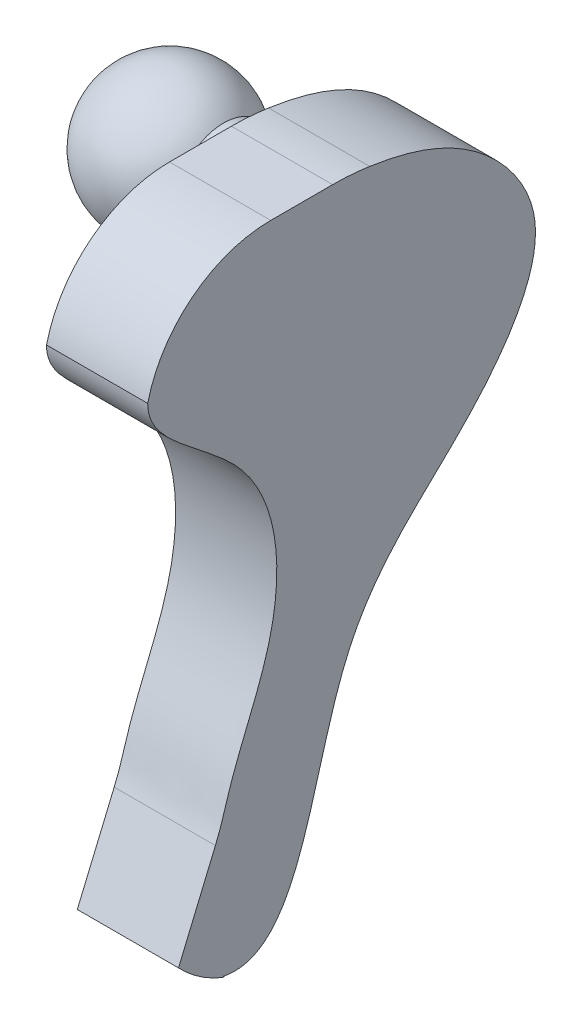
ISO-10303-21;
HEADER;
FILE_DESCRIPTION(('STEP AP214'),'2;1');
FILE_NAME('part.step','',(''),(''),'','','');
FILE_SCHEMA(('AUTOMOTIVE_DESIGN { 1 0 10303 214 1 1 1 1 }'));
ENDSEC;
DATA;
#1=APPLICATION_CONTEXT('core data for automotive mechanical design processes');
#2=APPLICATION_PROTOCOL_DEFINITION('international standard','automotive_design',2000,#1);
#3=PRODUCT_CONTEXT('',#1,'mechanical');
#4=PRODUCT('Part','Part','',(#3));
#5=PRODUCT_RELATED_PRODUCT_CATEGORY('part','',(#4));
#6=PRODUCT_DEFINITION_FORMATION('','',#4);
#7=PRODUCT_DEFINITION_CONTEXT('part definition',#1,'design');
#8=PRODUCT_DEFINITION('design','',#6,#7);
#9=PRODUCT_DEFINITION_SHAPE('','',#8);
#10=(LENGTH_UNIT() NAMED_UNIT(*) SI_UNIT(.MILLI.,.METRE.));
#11=(NAMED_UNIT(*) PLANE_ANGLE_UNIT() SI_UNIT($,.RADIAN.));
#12=(NAMED_UNIT(*) SI_UNIT($,.STERADIAN.) SOLID_ANGLE_UNIT());
#13=UNCERTAINTY_MEASURE_WITH_UNIT(LENGTH_MEASURE(1.E-05),#10,'distance_accuracy_value','');
#14=(GEOMETRIC_REPRESENTATION_CONTEXT(3) GLOBAL_UNCERTAINTY_ASSIGNED_CONTEXT((#13)) GLOBAL_UNIT_ASSIGNED_CONTEXT((#10,
#11,#12)) REPRESENTATION_CONTEXT('',''));
#15=CARTESIAN_POINT('',(0.,0.,0.));
#16=DIRECTION('',(0.,0.,1.));
#17=DIRECTION('',(1.,0.,0.));
#18=AXIS2_PLACEMENT_3D('',#15,#16,#17);
#19=CARTESIAN_POINT('',(0.,-10.,-8.89020005797834));
#20=DIRECTION('',(1.,0.,0.));
#21=DIRECTION('',(0.,0.,-1.));
#22=AXIS2_PLACEMENT_3D('',#19,#20,#21);
#23=CYLINDRICAL_SURFACE('',#22,10.);
#24=DIRECTION('',(1.,0.,0.));
#25=VECTOR('',#24,1.);
#26=CARTESIAN_POINT('',(4.,0.,-8.89020005797834));
#27=LINE('',#26,#25);
#28=CARTESIAN_POINT('',(4.,0.,-8.89020005797834));
#29=VERTEX_POINT('',#28);
#30=CARTESIAN_POINT('',(0.,0.,-8.89020005797834));
#31=VERTEX_POINT('',#30);
#32=EDGE_CURVE('E220',#29,#31,#27,.F.);
#33=ORIENTED_EDGE('',*,*,#32,.F.);
#34=CARTESIAN_POINT('',(4.,-10.,-8.89020005797834));
#35=DIRECTION('',(-1.,0.,0.));
#36=DIRECTION('',(0.,0.,1.));
#37=AXIS2_PLACEMENT_3D('',#34,#35,#36);
#38=CIRCLE('',#37,10.);
#39=CARTESIAN_POINT('',(4.,-0.108101078181222,-10.3566023631185));
#40=VERTEX_POINT('',#39);
#41=EDGE_CURVE('E222',#40,#29,#38,.F.);
#42=ORIENTED_EDGE('',*,*,#41,.F.);
#43=DIRECTION('',(1.,0.,0.));
#44=VECTOR('',#43,1.);
#45=CARTESIAN_POINT('',(0.,-0.108101078181222,-10.3566023631185));
#46=LINE('',#45,#44);
#47=CARTESIAN_POINT('',(0.,-0.108101078181222,-10.3566023631185));
#48=VERTEX_POINT('',#47);
#49=EDGE_CURVE('E224',#48,#40,#46,.T.);
#50=ORIENTED_EDGE('',*,*,#49,.F.);
#51=CARTESIAN_POINT('',(0.,-10.,-8.89020005797834));
#52=DIRECTION('',(-1.,0.,0.));
#53=DIRECTION('',(0.,0.,1.));
#54=AXIS2_PLACEMENT_3D('',#51,#52,#53);
#55=CIRCLE('',#54,10.);
#56=EDGE_CURVE('E40',#31,#48,#55,.T.);
#57=ORIENTED_EDGE('',*,*,#56,.F.);
#58=EDGE_LOOP('',(#33,#42,#50,#57));
#59=FACE_BOUND('',#58,.T.);
#60=ADVANCED_FACE('F32',(#59),#23,.T.);
#61=CARTESIAN_POINT('',(4.,0.,-6.44251884830741));
#62=DIRECTION('',(0.,-1.,0.));
#63=DIRECTION('',(0.,0.,-1.));
#64=AXIS2_PLACEMENT_3D('',#61,#62,#63);
#65=PLANE('',#64);
#66=DIRECTION('',(0.,0.,1.));
#67=VECTOR('',#66,1.);
#68=CARTESIAN_POINT('',(4.,0.,-6.44251884830741));
#69=LINE('',#68,#67);
#70=CARTESIAN_POINT('',(4.,0.,-6.44251884830741));
#71=VERTEX_POINT('',#70);
#72=EDGE_CURVE('E227',#29,#71,#69,.T.);
#73=ORIENTED_EDGE('',*,*,#72,.F.);
#74=ORIENTED_EDGE('',*,*,#32,.T.);
#75=DIRECTION('',(0.,0.,1.));
#76=VECTOR('',#75,1.);
#77=CARTESIAN_POINT('',(0.,0.,-6.44251884830741));
#78=LINE('',#77,#76);
#79=CARTESIAN_POINT('',(0.,0.,-6.44251884830741));
#80=VERTEX_POINT('',#79);
#81=EDGE_CURVE('E242',#31,#80,#78,.T.);
#82=ORIENTED_EDGE('',*,*,#81,.T.);
#83=DIRECTION('',(-1.,0.,0.));
#84=VECTOR('',#83,1.);
#85=CARTESIAN_POINT('',(4.,0.,-6.44251884830741));
#86=LINE('',#85,#84);
#87=EDGE_CURVE('E229',#71,#80,#86,.T.);
#88=ORIENTED_EDGE('',*,*,#87,.F.);
#89=EDGE_LOOP('',(#73,#74,#82,#88));
#90=FACE_BOUND('',#89,.T.);
#91=ADVANCED_FACE('F210',(#90),#65,.F.);
#92=CARTESIAN_POINT('',(4.,-5.,-6.44251884830737));
#93=DIRECTION('',(-1.,0.,0.));
#94=DIRECTION('',(0.,0.,1.));
#95=AXIS2_PLACEMENT_3D('',#92,#93,#94);
#96=CYLINDRICAL_SURFACE('',#95,5.);
#97=CARTESIAN_POINT('',(0.,-5.,-6.44251884830737));
#98=DIRECTION('',(1.,0.,0.));
#99=DIRECTION('',(0.,0.,1.));
#100=AXIS2_PLACEMENT_3D('',#97,#98,#99);
#101=CIRCLE('',#100,5.);
#102=CARTESIAN_POINT('',(0.,-3.83361375291554,-1.58046751963835));
#103=VERTEX_POINT('',#102);
#104=EDGE_CURVE('E236',#80,#103,#101,.T.);
#105=ORIENTED_EDGE('',*,*,#104,.T.);
#106=DIRECTION('',(1.,0.,0.));
#107=VECTOR('',#106,1.);
#108=CARTESIAN_POINT('',(-6.,-3.83361375291554,-1.58046751963835));
#109=LINE('',#108,#107);
#110=CARTESIAN_POINT('',(4.,-3.83361375291554,-1.58046751963835));
#111=VERTEX_POINT('',#110);
#112=EDGE_CURVE('E107',#103,#111,#109,.T.);
#113=ORIENTED_EDGE('',*,*,#112,.T.);
#114=CARTESIAN_POINT('',(4.,-5.,-6.44251884830737));
#115=DIRECTION('',(1.,0.,0.));
#116=DIRECTION('',(0.,0.,1.));
#117=AXIS2_PLACEMENT_3D('',#114,#115,#116);
#118=CIRCLE('',#117,5.);
#119=EDGE_CURVE('E232',#71,#111,#118,.T.);
#120=ORIENTED_EDGE('',*,*,#119,.F.);
#121=ORIENTED_EDGE('',*,*,#87,.T.);
#122=EDGE_LOOP('',(#105,#113,#120,#121));
#123=FACE_BOUND('',#122,.T.);
#124=ADVANCED_FACE('F206',(#123),#96,.T.);
#125=CARTESIAN_POINT('',(4.,-20.3454021103039,-6.44251884830737));
#126=DIRECTION('',(-1.,0.,0.));
#127=DIRECTION('',(0.,0.,1.));
#128=AXIS2_PLACEMENT_3D('',#125,#126,#127);
#129=CYLINDRICAL_SURFACE('',#128,5.);
#130=CARTESIAN_POINT('',(4.,-20.3454021103039,-6.44251884830737));
#131=DIRECTION('',(1.,0.,0.));
#132=DIRECTION('',(0.,0.,1.));
#133=AXIS2_PLACEMENT_3D('',#130,#131,#132);
#134=CIRCLE('',#133,5.);
#135=CARTESIAN_POINT('',(4.,-23.7676290327875,-2.79719816405634));
#136=VERTEX_POINT('',#135);
#137=CARTESIAN_POINT('',(4.,-24.9673450466533,-4.53525811806357));
#138=VERTEX_POINT('',#137);
#139=EDGE_CURVE('E234',#136,#138,#134,.T.);
#140=ORIENTED_EDGE('',*,*,#139,.F.);
#141=DIRECTION('',(-1.,0.,0.));
#142=VECTOR('',#141,1.);
#143=CARTESIAN_POINT('',(4.,-23.7676290327875,-2.79719816405635));
#144=LINE('',#143,#142);
#145=CARTESIAN_POINT('',(0.,-23.7676290327875,-2.79719816405635));
#146=VERTEX_POINT('',#145);
#147=EDGE_CURVE('E122',#136,#146,#144,.T.);
#148=ORIENTED_EDGE('',*,*,#147,.T.);
#149=CARTESIAN_POINT('',(0.,-20.3454021103039,-6.44251884830737));
#150=DIRECTION('',(1.,0.,0.));
#151=DIRECTION('',(0.,0.,1.));
#152=AXIS2_PLACEMENT_3D('',#149,#150,#151);
#153=CIRCLE('',#152,5.);
#154=CARTESIAN_POINT('',(0.,-24.9673450466533,-4.53525811806357));
#155=VERTEX_POINT('',#154);
#156=EDGE_CURVE('E120',#146,#155,#153,.T.);
#157=ORIENTED_EDGE('',*,*,#156,.T.);
#158=DIRECTION('',(1.,0.,0.));
#159=VECTOR('',#158,1.);
#160=CARTESIAN_POINT('',(-6.,-24.9673450466533,-4.53525811806358));
#161=LINE('',#160,#159);
#162=EDGE_CURVE('E174',#155,#138,#161,.T.);
#163=ORIENTED_EDGE('',*,*,#162,.T.);
#164=EDGE_LOOP('',(#140,#148,#157,#163));
#165=FACE_BOUND('',#164,.T.);
#166=ADVANCED_FACE('F200',(#165),#129,.T.);
#167=CARTESIAN_POINT('',(4.,-20.3454021103039,-13.4096193294607));
#168=DIRECTION('',(-1.,0.,0.));
#169=DIRECTION('',(0.,0.,1.));
#170=AXIS2_PLACEMENT_3D('',#167,#168,#169);
#171=PLANE('',#170);
#172=CARTESIAN_POINT('',(4.,0.,-9.46398265999981));
#173=CARTESIAN_POINT('',(4.,-0.168664697487083,-11.2075030009191));
#174=CARTESIAN_POINT('',(4.,-0.885845558257227,-14.4094371098565));
#175=CARTESIAN_POINT('',(4.,-5.60097300823879,-18.0930709122053));
#176=CARTESIAN_POINT('',(4.,-11.506879239675,-14.0349278188816));
#177=CARTESIAN_POINT('',(4.,-15.2393930061489,-8.19106930747239));
#178=CARTESIAN_POINT('',(4.,-27.2833064156389,-7.57529253879667));
#179=CARTESIAN_POINT('',(4.,-23.3044879221963,-1.44327655506523));
#180=CARTESIAN_POINT('',(4.,-21.1480104848914,-4.18145183436443));
#181=CARTESIAN_POINT('',(4.,-17.9621122269507,-4.87451716439374));
#182=CARTESIAN_POINT('',(4.,-13.8026627271112,-7.11898897478478));
#183=CARTESIAN_POINT('',(4.,-7.53032965837444,-6.5440494480064));
#184=CARTESIAN_POINT('',(4.,-4.84801633932555,-0.424200341636191));
#185=CARTESIAN_POINT('',(4.,-0.8121095912682,-3.03315303175542));
#186=CARTESIAN_POINT('',(4.,0.150810087515933,-6.16364399963838));
#187=CARTESIAN_POINT('',(4.,0.0976871789813631,-8.45417096769786));
#188=CARTESIAN_POINT('',(4.,0.,-9.46398265999981));
#189=B_SPLINE_CURVE_WITH_KNOTS('',3,(#172,#173,#174,#175,#176,#177,#178,#179,#180,#181,#182,
#183,#184,#185,#186,#187,#188),.UNSPECIFIED.,.T.,.F.,(4,1,1,1,1,1,1,1,1,1,1,1,1,1,4),(0.,
0.0779462206245738,0.143334378897667,0.228662797986688,0.34549718402757,0.49327154543466,
0.530449611955508,0.570400737368921,0.608236932320176,0.680812242057208,0.778589658100487,
0.85710748647938,0.897676897296645,0.954855126659468,1.),.UNSPECIFIED.);
#190=CARTESIAN_POINT('',(4.,-20.3068283020613,-4.2559361978416));
#191=VERTEX_POINT('',#190);
#192=EDGE_CURVE('E387',#191,#111,#189,.T.);
#193=ORIENTED_EDGE('',*,*,#192,.F.);
#194=DIRECTION('',(0.,-0.921486867455821,0.388409517270701));
#195=VECTOR('',#194,1.);
#196=CARTESIAN_POINT('',(4.,-17.063348980249,-5.62307259680175));
#197=LINE('',#196,#195);
#198=EDGE_CURVE('E47',#191,#136,#197,.T.);
#199=ORIENTED_EDGE('',*,*,#198,.T.);
#200=ORIENTED_EDGE('',*,*,#139,.T.);
#201=CARTESIAN_POINT('',(4.,-24.6463789862283,-6.87662953852897));
#202=CARTESIAN_POINT('',(4.,-24.6976036054736,-6.34865285678219));
#203=CARTESIAN_POINT('',(4.,-25.1810411070529,-5.70517041603861));
#204=CARTESIAN_POINT('',(4.,-24.6439737268939,-2.96717959946021));
#205=CARTESIAN_POINT('',(4.,-26.5247151757715,-6.79867928296908));
#206=CARTESIAN_POINT('',(4.,-25.4377812076341,-10.1982205077126));
#207=CARTESIAN_POINT('',(4.,-24.5623433988899,-7.74279177077801));
#208=CARTESIAN_POINT('',(4.,-24.6463789862283,-6.87662953852897));
#209=B_SPLINE_CURVE_WITH_KNOTS('',3,(#201,#202,#203,#204,#205,#206,#207,#208),.UNSPECIFIED.,.T.,
.F.,(4,1,1,1,1,4),(0.,0.142115472516294,0.262842986327426,0.57618363660915,0.766855129842875,
1.),.UNSPECIFIED.);
#210=CARTESIAN_POINT('',(4.,-24.9754382899134,-4.62207240952031));
#211=VERTEX_POINT('',#210);
#212=EDGE_CURVE('E139',#211,#138,#209,.T.);
#213=ORIENTED_EDGE('',*,*,#212,.F.);
#214=CARTESIAN_POINT('',(4.,-24.8659980937708,-4.40682622304461));
#215=CARTESIAN_POINT('',(4.,-25.5656102420994,-5.64326897110136));
#216=CARTESIAN_POINT('',(4.,-24.3965311519043,-9.32752984598735));
#217=CARTESIAN_POINT('',(4.,-37.6373865505527,-20.9490535253005));
#218=CARTESIAN_POINT('',(4.,7.04668932132763,-40.1080361356464));
#219=CARTESIAN_POINT('',(4.,5.04572595414695,-11.067178353838));
#220=CARTESIAN_POINT('',(4.,4.10433483589114,13.2242876999897));
#221=CARTESIAN_POINT('',(4.,-20.1620323431838,4.69415788094612));
#222=CARTESIAN_POINT('',(4.,-23.304173715489,-2.46978145232845));
#223=B_SPLINE_CURVE_WITH_KNOTS('',3,(#214,#215,#216,#217,#218,#219,#220,#221,#222),
.UNSPECIFIED.,.F.,.F.,(4,1,1,1,1,1,4),(0.,0.0384597484958003,0.0972966500268078,
0.409886449456031,0.593670055107859,0.744469586063736,1.),.UNSPECIFIED.);
#224=CARTESIAN_POINT('',(4.,-24.9378851477119,-4.54273995287266));
#225=VERTEX_POINT('',#224);
#226=EDGE_CURVE('E381',#225,#211,#223,.T.);
#227=ORIENTED_EDGE('',*,*,#226,.F.);
#228=CARTESIAN_POINT('',(4.,0.,-9.46398265999981));
#229=CARTESIAN_POINT('',(4.,-0.168664697487083,-11.2075030009191));
#230=CARTESIAN_POINT('',(4.,-0.885845558257227,-14.4094371098565));
#231=CARTESIAN_POINT('',(4.,-5.60097300823879,-18.0930709122053));
#232=CARTESIAN_POINT('',(4.,-11.506879239675,-14.0349278188816));
#233=CARTESIAN_POINT('',(4.,-15.2393930061489,-8.19106930747239));
#234=CARTESIAN_POINT('',(4.,-27.2833064156389,-7.57529253879667));
#235=CARTESIAN_POINT('',(4.,-23.3044879221963,-1.44327655506523));
#236=CARTESIAN_POINT('',(4.,-21.1480104848914,-4.18145183436443));
#237=CARTESIAN_POINT('',(4.,-17.9621122269507,-4.87451716439374));
#238=CARTESIAN_POINT('',(4.,-13.8026627271112,-7.11898897478478));
#239=CARTESIAN_POINT('',(4.,-7.53032965837444,-6.5440494480064));
#240=CARTESIAN_POINT('',(4.,-4.84801633932555,-0.424200341636191));
#241=CARTESIAN_POINT('',(4.,-0.8121095912682,-3.03315303175542));
#242=CARTESIAN_POINT('',(4.,0.150810087515933,-6.16364399963838));
#243=CARTESIAN_POINT('',(4.,0.0976871789813631,-8.45417096769786));
#244=CARTESIAN_POINT('',(4.,0.,-9.46398265999981));
#245=B_SPLINE_CURVE_WITH_KNOTS('',3,(#228,#229,#230,#231,#232,#233,#234,#235,#236,#237,#238,
#239,#240,#241,#242,#243,#244),.UNSPECIFIED.,.T.,.F.,(4,1,1,1,1,1,1,1,1,1,1,1,1,1,4),(0.,
0.0779462206245738,0.143334378897667,0.228662797986688,0.34549718402757,0.49327154543466,
0.530449611955508,0.570400737368921,0.608236932320176,0.680812242057208,0.778589658100487,
0.85710748647938,0.897676897296645,0.954855126659468,1.),.UNSPECIFIED.);
#246=EDGE_CURVE('E180',#40,#225,#245,.T.);
#247=ORIENTED_EDGE('',*,*,#246,.F.);
#248=ORIENTED_EDGE('',*,*,#41,.T.);
#249=ORIENTED_EDGE('',*,*,#72,.T.);
#250=ORIENTED_EDGE('',*,*,#119,.T.);
#251=EDGE_LOOP('',(#193,#199,#200,#213,#227,#247,#248,#249,#250));
#252=FACE_BOUND('',#251,.T.);
#253=ADVANCED_FACE('F197',(#252),#171,.F.);
#254=CARTESIAN_POINT('',(0.,-20.3454021103039,-13.4096193294607));
#255=DIRECTION('',(-1.,0.,0.));
#256=DIRECTION('',(0.,0.,1.));
#257=AXIS2_PLACEMENT_3D('',#254,#255,#256);
#258=PLANE('',#257);
#259=CARTESIAN_POINT('',(0.,-20.1409876750939,-4.32583852650107));
#260=CARTESIAN_POINT('',(0.,-24.5054493005803,-2.48620467715277));
#261=B_SPLINE_CURVE_WITH_KNOTS('',1,(#259,#260),.UNSPECIFIED.,.F.,.F.,(2,2),(0.,1.),.UNSPECIFIED.);
#262=CARTESIAN_POINT('',(0.,-20.3068282752446,-4.25593620914493));
#263=VERTEX_POINT('',#262);
#264=EDGE_CURVE('E114',#263,#146,#261,.T.);
#265=ORIENTED_EDGE('',*,*,#264,.F.);
#266=CARTESIAN_POINT('',(0.,0.,-9.46398265999981));
#267=CARTESIAN_POINT('',(0.,-0.168664697487083,-11.2075030009191));
#268=CARTESIAN_POINT('',(0.,-0.885845558257227,-14.4094371098565));
#269=CARTESIAN_POINT('',(0.,-5.60097300823879,-18.0930709122053));
#270=CARTESIAN_POINT('',(0.,-11.506879239675,-14.0349278188816));
#271=CARTESIAN_POINT('',(0.,-15.2393930061489,-8.19106930747239));
#272=CARTESIAN_POINT('',(0.,-27.2833064156389,-7.57529253879667));
#273=CARTESIAN_POINT('',(0.,-23.3044879221963,-1.44327655506523));
#274=CARTESIAN_POINT('',(0.,-21.1480104848914,-4.18145183436443));
#275=CARTESIAN_POINT('',(0.,-17.9621122269507,-4.87451716439374));
#276=CARTESIAN_POINT('',(0.,-13.8026627271112,-7.11898897478478));
#277=CARTESIAN_POINT('',(0.,-7.53032965837444,-6.5440494480064));
#278=CARTESIAN_POINT('',(0.,-4.84801633932555,-0.424200341636191));
#279=CARTESIAN_POINT('',(0.,-0.8121095912682,-3.03315303175542));
#280=CARTESIAN_POINT('',(0.,0.150810087515933,-6.16364399963838));
#281=CARTESIAN_POINT('',(0.,0.0976871789813631,-8.45417096769786));
#282=CARTESIAN_POINT('',(0.,0.,-9.46398265999981));
#283=B_SPLINE_CURVE_WITH_KNOTS('',3,(#266,#267,#268,#269,#270,#271,#272,#273,#274,#275,#276,
#277,#278,#279,#280,#281,#282),.UNSPECIFIED.,.T.,.F.,(4,1,1,1,1,1,1,1,1,1,1,1,1,1,4),(0.,
0.0779462206245738,0.143334378897667,0.228662797986688,0.34549718402757,0.49327154543466,
0.530449611955508,0.570400737368921,0.608236932320176,0.680812242057208,0.778589658100487,
0.85710748647938,0.897676897296645,0.954855126659468,1.),.UNSPECIFIED.);
#284=EDGE_CURVE('E103',#103,#263,#283,.F.);
#285=ORIENTED_EDGE('',*,*,#284,.F.);
#286=ORIENTED_EDGE('',*,*,#104,.F.);
#287=ORIENTED_EDGE('',*,*,#81,.F.);
#288=ORIENTED_EDGE('',*,*,#56,.T.);
#289=CARTESIAN_POINT('',(0.,0.,-9.46398265999981));
#290=CARTESIAN_POINT('',(0.,-0.168664697487083,-11.2075030009191));
#291=CARTESIAN_POINT('',(0.,-0.885845558257227,-14.4094371098565));
#292=CARTESIAN_POINT('',(0.,-5.60097300823879,-18.0930709122053));
#293=CARTESIAN_POINT('',(0.,-11.506879239675,-14.0349278188816));
#294=CARTESIAN_POINT('',(0.,-15.2393930061489,-8.19106930747239));
#295=CARTESIAN_POINT('',(0.,-27.2833064156389,-7.57529253879667));
#296=CARTESIAN_POINT('',(0.,-23.3044879221963,-1.44327655506523));
#297=CARTESIAN_POINT('',(0.,-21.1480104848914,-4.18145183436443));
#298=CARTESIAN_POINT('',(0.,-17.9621122269507,-4.87451716439374));
#299=CARTESIAN_POINT('',(0.,-13.8026627271112,-7.11898897478478));
#300=CARTESIAN_POINT('',(0.,-7.53032965837444,-6.5440494480064));
#301=CARTESIAN_POINT('',(0.,-4.84801633932555,-0.424200341636191));
#302=CARTESIAN_POINT('',(0.,-0.8121095912682,-3.03315303175542));
#303=CARTESIAN_POINT('',(0.,0.150810087515933,-6.16364399963838));
#304=CARTESIAN_POINT('',(0.,0.0976871789813631,-8.45417096769786));
#305=CARTESIAN_POINT('',(0.,0.,-9.46398265999981));
#306=B_SPLINE_CURVE_WITH_KNOTS('',3,(#289,#290,#291,#292,#293,#294,#295,#296,#297,#298,#299,
#300,#301,#302,#303,#304,#305),.UNSPECIFIED.,.T.,.F.,(4,1,1,1,1,1,1,1,1,1,1,1,1,1,4),(0.,
0.0779462206245738,0.143334378897667,0.228662797986688,0.34549718402757,0.49327154543466,
0.530449611955508,0.570400737368921,0.608236932320176,0.680812242057208,0.778589658100487,
0.85710748647938,0.897676897296645,0.954855126659468,1.),.UNSPECIFIED.);
#307=CARTESIAN_POINT('',(0.,-24.9378851477119,-4.54273995287266));
#308=VERTEX_POINT('',#307);
#309=EDGE_CURVE('E111',#308,#48,#306,.F.);
#310=ORIENTED_EDGE('',*,*,#309,.F.);
#311=CARTESIAN_POINT('',(0.,-24.8659980937708,-4.40682622304461));
#312=CARTESIAN_POINT('',(0.,-25.5656102420994,-5.64326897110136));
#313=CARTESIAN_POINT('',(0.,-24.3965311519043,-9.32752984598735));
#314=CARTESIAN_POINT('',(0.,-37.6373865505527,-20.9490535253005));
#315=CARTESIAN_POINT('',(0.,7.04668932132763,-40.1080361356464));
#316=CARTESIAN_POINT('',(0.,5.04572595414695,-11.067178353838));
#317=CARTESIAN_POINT('',(0.,4.10433483589114,13.2242876999897));
#318=CARTESIAN_POINT('',(0.,-20.1620323431838,4.69415788094612));
#319=CARTESIAN_POINT('',(0.,-23.304173715489,-2.46978145232845));
#320=B_SPLINE_CURVE_WITH_KNOTS('',3,(#311,#312,#313,#314,#315,#316,#317,#318,#319),
.UNSPECIFIED.,.F.,.F.,(4,1,1,1,1,1,4),(0.,0.0384597484958003,0.0972966500268078,
0.409886449456031,0.593670055107859,0.744469586063736,1.),.UNSPECIFIED.);
#321=CARTESIAN_POINT('',(0.,-24.9754382879083,-4.62207238846982));
#322=VERTEX_POINT('',#321);
#323=EDGE_CURVE('E246',#322,#308,#320,.F.);
#324=ORIENTED_EDGE('',*,*,#323,.F.);
#325=CARTESIAN_POINT('',(0.,-24.6463789862283,-6.87662953852897));
#326=CARTESIAN_POINT('',(0.,-24.6976036054736,-6.34865285678219));
#327=CARTESIAN_POINT('',(0.,-25.1810411070529,-5.70517041603861));
#328=CARTESIAN_POINT('',(0.,-24.6439737268939,-2.96717959946021));
#329=CARTESIAN_POINT('',(0.,-26.5247151757715,-6.79867928296908));
#330=CARTESIAN_POINT('',(0.,-25.4377812076341,-10.1982205077126));
#331=CARTESIAN_POINT('',(0.,-24.5623433988899,-7.74279177077801));
#332=CARTESIAN_POINT('',(0.,-24.6463789862283,-6.87662953852897));
#333=B_SPLINE_CURVE_WITH_KNOTS('',3,(#325,#326,#327,#328,#329,#330,#331,#332),.UNSPECIFIED.,.T.,
.F.,(4,1,1,1,1,4),(0.,0.142115472516294,0.262842986327426,0.57618363660915,0.766855129842875,
1.),.UNSPECIFIED.);
#334=EDGE_CURVE('E167',#155,#322,#333,.F.);
#335=ORIENTED_EDGE('',*,*,#334,.F.);
#336=ORIENTED_EDGE('',*,*,#156,.F.);
#337=EDGE_LOOP('',(#265,#285,#286,#287,#288,#310,#324,#335,#336));
#338=FACE_BOUND('',#337,.T.);
#339=CARTESIAN_POINT('',(0.,-5.17694696722693,-12.0792389764325));
#340=DIRECTION('',(-1.,0.,0.));
#341=DIRECTION('',(0.,0.917226045230669,0.398367144667463));
#342=AXIS2_PLACEMENT_3D('',#339,#340,#341);
#343=ELLIPSE('',#342,1.83432270993306,1.64818157560468);
#344=CARTESIAN_POINT('',(0.,-3.49445840231822,-11.3485050760778));
#345=VERTEX_POINT('',#344);
#346=EDGE_CURVE('E140',#345,#345,#343,.T.);
#347=ORIENTED_EDGE('',*,*,#346,.F.);
#348=EDGE_LOOP('',(#347));
#349=FACE_BOUND('',#348,.T.);
#350=ADVANCED_FACE('F117',(#338,#349),#258,.T.);
#351=CARTESIAN_POINT('',(-6.,-24.8659980937708,-4.40682622304461));
#352=CARTESIAN_POINT('',(-6.,-25.5656102420994,-5.64326897110136));
#353=CARTESIAN_POINT('',(-6.,-24.3965311519043,-9.32752984598735));
#354=CARTESIAN_POINT('',(-6.,-37.6373865505527,-20.9490535253005));
#355=CARTESIAN_POINT('',(-6.,7.04668932132763,-40.1080361356464));
#356=CARTESIAN_POINT('',(-6.,5.04572595414695,-11.067178353838));
#357=CARTESIAN_POINT('',(-6.,4.10433483589114,13.2242876999897));
#358=CARTESIAN_POINT('',(-6.,-20.1620323431838,4.69415788094612));
#359=CARTESIAN_POINT('',(-6.,-23.304173715489,-2.46978145232845));
#360=B_SPLINE_CURVE_WITH_KNOTS('',3,(#351,#352,#353,#354,#355,#356,#357,#358,#359),
.UNSPECIFIED.,.F.,.F.,(4,1,1,1,1,1,4),(0.,0.0384597484958003,0.0972966500268078,
0.409886449456031,0.593670055107859,0.744469586063736,1.),.UNSPECIFIED.);
#361=DIRECTION('',(1.,0.,0.));
#362=VECTOR('',#361,1.);
#363=SURFACE_OF_LINEAR_EXTRUSION('',#360,#362);
#364=ORIENTED_EDGE('',*,*,#226,.T.);
#365=DIRECTION('',(1.,0.,0.));
#366=VECTOR('',#365,1.);
#367=CARTESIAN_POINT('',(-6.,-24.9754382879083,-4.62207238846981));
#368=LINE('',#367,#366);
#369=EDGE_CURVE('E110',#211,#322,#368,.F.);
#370=ORIENTED_EDGE('',*,*,#369,.T.);
#371=ORIENTED_EDGE('',*,*,#323,.T.);
#372=DIRECTION('',(1.,0.,0.));
#373=VECTOR('',#372,1.);
#374=CARTESIAN_POINT('',(-6.,-24.9378851477119,-4.54273995287266));
#375=LINE('',#374,#373);
#376=EDGE_CURVE('E384',#308,#225,#375,.T.);
#377=ORIENTED_EDGE('',*,*,#376,.T.);
#378=EDGE_LOOP('',(#364,#370,#371,#377));
#379=FACE_BOUND('',#378,.T.);
#380=ADVANCED_FACE('F195',(#379),#363,.F.);
#381=CARTESIAN_POINT('',(-6.,0.,-9.46398265999981));
#382=CARTESIAN_POINT('',(-6.,-0.168664697487083,-11.2075030009191));
#383=CARTESIAN_POINT('',(-6.,-0.885845558257227,-14.4094371098565));
#384=CARTESIAN_POINT('',(-6.,-5.60097300823879,-18.0930709122053));
#385=CARTESIAN_POINT('',(-6.,-11.506879239675,-14.0349278188816));
#386=CARTESIAN_POINT('',(-6.,-15.2393930061489,-8.19106930747239));
#387=CARTESIAN_POINT('',(-6.,-27.2833064156389,-7.57529253879667));
#388=CARTESIAN_POINT('',(-6.,-23.3044879221963,-1.44327655506523));
#389=CARTESIAN_POINT('',(-6.,-21.1480104848914,-4.18145183436443));
#390=CARTESIAN_POINT('',(-6.,-17.9621122269507,-4.87451716439374));
#391=CARTESIAN_POINT('',(-6.,-13.8026627271112,-7.11898897478478));
#392=CARTESIAN_POINT('',(-6.,-7.53032965837444,-6.5440494480064));
#393=CARTESIAN_POINT('',(-6.,-4.84801633932555,-0.424200341636191));
#394=CARTESIAN_POINT('',(-6.,-0.8121095912682,-3.03315303175542));
#395=CARTESIAN_POINT('',(-6.,0.150810087515933,-6.16364399963838));
#396=CARTESIAN_POINT('',(-6.,0.0976871789813631,-8.45417096769786));
#397=CARTESIAN_POINT('',(-6.,0.,-9.46398265999981));
#398=B_SPLINE_CURVE_WITH_KNOTS('',3,(#381,#382,#383,#384,#385,#386,#387,#388,#389,#390,#391,
#392,#393,#394,#395,#396,#397),.UNSPECIFIED.,.T.,.F.,(4,1,1,1,1,1,1,1,1,1,1,1,1,1,4),(0.,
0.0779462206245738,0.143334378897667,0.228662797986688,0.34549718402757,0.49327154543466,
0.530449611955508,0.570400737368921,0.608236932320176,0.680812242057208,0.778589658100487,
0.85710748647938,0.897676897296645,0.954855126659468,1.),.UNSPECIFIED.);
#399=DIRECTION('',(1.,0.,0.));
#400=VECTOR('',#399,1.);
#401=SURFACE_OF_LINEAR_EXTRUSION('',#398,#400);
#402=ORIENTED_EDGE('',*,*,#309,.T.);
#403=ORIENTED_EDGE('',*,*,#49,.T.);
#404=ORIENTED_EDGE('',*,*,#246,.T.);
#405=ORIENTED_EDGE('',*,*,#376,.F.);
#406=EDGE_LOOP('',(#402,#403,#404,#405));
#407=FACE_BOUND('',#406,.T.);
#408=ADVANCED_FACE('F192',(#407),#401,.F.);
#409=CARTESIAN_POINT('',(-6.,0.,-9.46398265999981));
#410=CARTESIAN_POINT('',(-6.,-0.168664697487083,-11.2075030009191));
#411=CARTESIAN_POINT('',(-6.,-0.885845558257227,-14.4094371098565));
#412=CARTESIAN_POINT('',(-6.,-5.60097300823879,-18.0930709122053));
#413=CARTESIAN_POINT('',(-6.,-11.506879239675,-14.0349278188816));
#414=CARTESIAN_POINT('',(-6.,-15.2393930061489,-8.19106930747239));
#415=CARTESIAN_POINT('',(-6.,-27.2833064156389,-7.57529253879667));
#416=CARTESIAN_POINT('',(-6.,-23.3044879221963,-1.44327655506523));
#417=CARTESIAN_POINT('',(-6.,-21.1480104848914,-4.18145183436443));
#418=CARTESIAN_POINT('',(-6.,-17.9621122269507,-4.87451716439374));
#419=CARTESIAN_POINT('',(-6.,-13.8026627271112,-7.11898897478478));
#420=CARTESIAN_POINT('',(-6.,-7.53032965837444,-6.5440494480064));
#421=CARTESIAN_POINT('',(-6.,-4.84801633932555,-0.424200341636191));
#422=CARTESIAN_POINT('',(-6.,-0.8121095912682,-3.03315303175542));
#423=CARTESIAN_POINT('',(-6.,0.150810087515933,-6.16364399963838));
#424=CARTESIAN_POINT('',(-6.,0.0976871789813631,-8.45417096769786));
#425=CARTESIAN_POINT('',(-6.,0.,-9.46398265999981));
#426=B_SPLINE_CURVE_WITH_KNOTS('',3,(#409,#410,#411,#412,#413,#414,#415,#416,#417,#418,#419,
#420,#421,#422,#423,#424,#425),.UNSPECIFIED.,.T.,.F.,(4,1,1,1,1,1,1,1,1,1,1,1,1,1,4),(0.,
0.0779462206245738,0.143334378897667,0.228662797986688,0.34549718402757,0.49327154543466,
0.530449611955508,0.570400737368921,0.608236932320176,0.680812242057208,0.778589658100487,
0.85710748647938,0.897676897296645,0.954855126659468,1.),.UNSPECIFIED.);
#427=DIRECTION('',(1.,0.,0.));
#428=VECTOR('',#427,1.);
#429=SURFACE_OF_LINEAR_EXTRUSION('',#426,#428);
#430=ORIENTED_EDGE('',*,*,#284,.T.);
#431=DIRECTION('',(1.,0.,0.));
#432=VECTOR('',#431,1.);
#433=CARTESIAN_POINT('',(2.,-20.3068283020613,-4.2559361978416));
#434=LINE('',#433,#432);
#435=EDGE_CURVE('E11',#263,#191,#434,.T.);
#436=ORIENTED_EDGE('',*,*,#435,.T.);
#437=ORIENTED_EDGE('',*,*,#192,.T.);
#438=ORIENTED_EDGE('',*,*,#112,.F.);
#439=EDGE_LOOP('',(#430,#436,#437,#438));
#440=FACE_BOUND('',#439,.T.);
#441=ADVANCED_FACE('F104',(#440),#429,.F.);
#442=CARTESIAN_POINT('',(-6.,-24.6463789862283,-6.87662953852897));
#443=CARTESIAN_POINT('',(-6.,-24.6976036054736,-6.34865285678219));
#444=CARTESIAN_POINT('',(-6.,-25.1810411070529,-5.70517041603861));
#445=CARTESIAN_POINT('',(-6.,-24.6439737268939,-2.96717959946021));
#446=CARTESIAN_POINT('',(-6.,-26.5247151757715,-6.79867928296908));
#447=CARTESIAN_POINT('',(-6.,-25.4377812076341,-10.1982205077126));
#448=CARTESIAN_POINT('',(-6.,-24.5623433988899,-7.74279177077801));
#449=CARTESIAN_POINT('',(-6.,-24.6463789862283,-6.87662953852897));
#450=B_SPLINE_CURVE_WITH_KNOTS('',3,(#442,#443,#444,#445,#446,#447,#448,#449),.UNSPECIFIED.,.T.,
.F.,(4,1,1,1,1,4),(0.,0.142115472516294,0.262842986327426,0.57618363660915,0.766855129842875,
1.),.UNSPECIFIED.);
#451=DIRECTION('',(1.,0.,0.));
#452=VECTOR('',#451,1.);
#453=SURFACE_OF_LINEAR_EXTRUSION('',#450,#452);
#454=ORIENTED_EDGE('',*,*,#334,.T.);
#455=ORIENTED_EDGE('',*,*,#369,.F.);
#456=ORIENTED_EDGE('',*,*,#212,.T.);
#457=ORIENTED_EDGE('',*,*,#162,.F.);
#458=EDGE_LOOP('',(#454,#455,#456,#457));
#459=FACE_BOUND('',#458,.T.);
#460=ADVANCED_FACE('F148',(#459),#453,.F.);
#461=CARTESIAN_POINT('',(-3.,-5.17694696722693,-12.0792389764325));
#462=DIRECTION('',(-1.,0.,0.));
#463=DIRECTION('',(0.,0.917226045230669,0.398367144667463));
#464=AXIS2_PLACEMENT_3D('',#461,#462,#463);
#465=ELLIPSE('',#464,1.83432270993306,1.64818157560468);
#466=DIRECTION('',(1.,0.,0.));
#467=VECTOR('',#466,1.);
#468=SURFACE_OF_LINEAR_EXTRUSION('',#465,#467);
#469=CARTESIAN_POINT('',(-3.,-3.49445840231822,-11.3485050760778));
#470=VERTEX_POINT('',#469);
#471=EDGE_CURVE('E135',#470,#470,#465,.T.);
#472=ORIENTED_EDGE('',*,*,#471,.F.);
#473=EDGE_LOOP('',(#472));
#474=FACE_BOUND('',#473,.T.);
#475=ORIENTED_EDGE('',*,*,#346,.T.);
#476=EDGE_LOOP('',(#475));
#477=FACE_BOUND('',#476,.T.);
#478=ADVANCED_FACE('F143',(#474,#477),#468,.F.);
#479=CARTESIAN_POINT('',(-3.5,-5.17694696722693,-12.0792389764325));
#480=DIRECTION('',(1.,0.,0.));
#481=DIRECTION('',(0.,0.,-1.));
#482=AXIS2_PLACEMENT_3D('',#479,#480,#481);
#483=CYLINDRICAL_SURFACE('',#482,1.94140372408132);
#484=CARTESIAN_POINT('',(-3.5,-5.17694696722693,-12.0792389764325));
#485=DIRECTION('',(-1.,0.,0.));
#486=DIRECTION('',(0.,0.,1.));
#487=AXIS2_PLACEMENT_3D('',#484,#485,#486);
#488=CIRCLE('',#487,1.94140372408132);
#489=CARTESIAN_POINT('',(-3.5,-5.17694696722693,-10.1378352523512));
#490=VERTEX_POINT('',#489);
#491=EDGE_CURVE('E134',#490,#490,#488,.T.);
#492=ORIENTED_EDGE('',*,*,#491,.F.);
#493=EDGE_LOOP('',(#492));
#494=FACE_BOUND('',#493,.T.);
#495=CARTESIAN_POINT('',(-3.,-5.17694696722693,-12.0792389764325));
#496=DIRECTION('',(-1.,0.,0.));
#497=DIRECTION('',(0.,0.,1.));
#498=AXIS2_PLACEMENT_3D('',#495,#496,#497);
#499=CIRCLE('',#498,1.94140372408132);
#500=CARTESIAN_POINT('',(-3.,-5.17694696722693,-10.1378352523512));
#501=VERTEX_POINT('',#500);
#502=EDGE_CURVE('E131',#501,#501,#499,.T.);
#503=ORIENTED_EDGE('',*,*,#502,.T.);
#504=EDGE_LOOP('',(#503));
#505=FACE_BOUND('',#504,.T.);
#506=ADVANCED_FACE('F147',(#494,#505),#483,.T.);
#507=CARTESIAN_POINT('',(-5.62309515801232,-5.17694696722693,-12.0792389764325));
#508=DIRECTION('',(0.,0.,1.));
#509=DIRECTION('',(1.,0.,0.));
#510=AXIS2_PLACEMENT_3D('',#507,#508,#509);
#511=SPHERICAL_SURFACE('',#510,2.87690484198768);
#512=CARTESIAN_POINT('',(-5.62309515801232,-5.17694696722693,-12.0792389764325));
#513=DIRECTION('',(-1.,0.,0.));
#514=DIRECTION('',(0.,0.,1.));
#515=AXIS2_PLACEMENT_3D('',#512,#513,#514);
#516=SPHERICAL_SURFACE('',#515,2.87690484198768);
#517=ORIENTED_EDGE('',*,*,#491,.T.);
#518=EDGE_LOOP('',(#517));
#519=FACE_BOUND('',#518,.T.);
#520=ADVANCED_FACE('F34',(#519),#516,.T.);
#521=CARTESIAN_POINT('',(-3.,-5.17694696722693,-12.0792389764325));
#522=DIRECTION('',(-1.,0.,0.));
#523=DIRECTION('',(0.,0.,1.));
#524=AXIS2_PLACEMENT_3D('',#521,#522,#523);
#525=PLANE('',#524);
#526=ORIENTED_EDGE('',*,*,#471,.T.);
#527=EDGE_LOOP('',(#526));
#528=FACE_BOUND('',#527,.T.);
#529=ORIENTED_EDGE('',*,*,#502,.F.);
#530=EDGE_LOOP('',(#529));
#531=FACE_BOUND('',#530,.T.);
#532=ADVANCED_FACE('F280',(#528,#531),#525,.F.);
#533=CARTESIAN_POINT('',(5.,-20.1409876750939,-4.32583852650107));
#534=DIRECTION('',(0.,-0.388409517270701,-0.921486867455821));
#535=DIRECTION('',(0.,0.921486867455821,-0.388409517270701));
#536=AXIS2_PLACEMENT_3D('',#533,#534,#535);
#537=PLANE('',#536);
#538=ORIENTED_EDGE('',*,*,#198,.F.);
#539=ORIENTED_EDGE('',*,*,#435,.F.);
#540=ORIENTED_EDGE('',*,*,#264,.T.);
#541=ORIENTED_EDGE('',*,*,#147,.F.);
#542=EDGE_LOOP('',(#538,#539,#540,#541));
#543=FACE_BOUND('',#542,.T.);
#544=ADVANCED_FACE('F113',(#543),#537,.F.);
#545=CLOSED_SHELL('',(#60,#91,#124,#166,#253,#350,#380,#408,#441,#460,#478,#506,#520,#532,#544));
#546=MANIFOLD_SOLID_BREP('B2',#545);
#547=ADVANCED_BREP_SHAPE_REPRESENTATION('',(#18,#546),#14);
#548=SHAPE_DEFINITION_REPRESENTATION(#9,#547);
ENDSEC;
END-ISO-10303-21;
